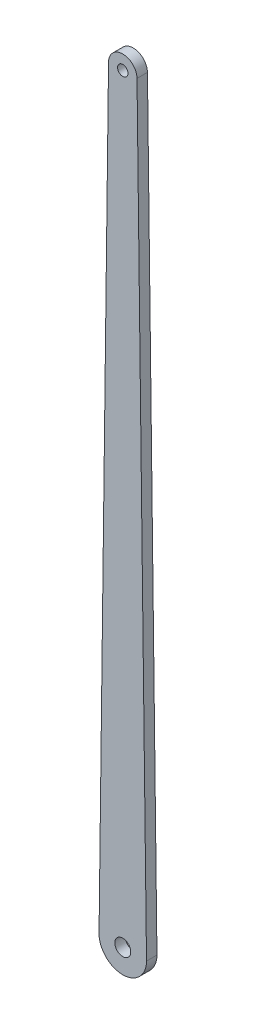
ISO-10303-21;
HEADER;
FILE_DESCRIPTION(('STEP AP214'),'2;1');
FILE_NAME('part.step','',(''),(''),'','','');
FILE_SCHEMA(('AUTOMOTIVE_DESIGN { 1 0 10303 214 1 1 1 1 }'));
ENDSEC;
DATA;
#1=APPLICATION_CONTEXT('core data for automotive mechanical design processes');
#2=APPLICATION_PROTOCOL_DEFINITION('international standard','automotive_design',2000,#1);
#3=PRODUCT_CONTEXT('',#1,'mechanical');
#4=PRODUCT('Part','Part','',(#3));
#5=PRODUCT_RELATED_PRODUCT_CATEGORY('part','',(#4));
#6=PRODUCT_DEFINITION_FORMATION('','',#4);
#7=PRODUCT_DEFINITION_CONTEXT('part definition',#1,'design');
#8=PRODUCT_DEFINITION('design','',#6,#7);
#9=PRODUCT_DEFINITION_SHAPE('','',#8);
#10=(LENGTH_UNIT() NAMED_UNIT(*) SI_UNIT(.MILLI.,.METRE.));
#11=(NAMED_UNIT(*) PLANE_ANGLE_UNIT() SI_UNIT($,.RADIAN.));
#12=(NAMED_UNIT(*) SI_UNIT($,.STERADIAN.) SOLID_ANGLE_UNIT());
#13=UNCERTAINTY_MEASURE_WITH_UNIT(LENGTH_MEASURE(1.E-05),#10,'distance_accuracy_value','');
#14=(GEOMETRIC_REPRESENTATION_CONTEXT(3) GLOBAL_UNCERTAINTY_ASSIGNED_CONTEXT((#13)) GLOBAL_UNIT_ASSIGNED_CONTEXT((#10,
#11,#12)) REPRESENTATION_CONTEXT('',''));
#15=CARTESIAN_POINT('',(0.,0.,0.));
#16=DIRECTION('',(0.,0.,1.));
#17=DIRECTION('',(1.,0.,0.));
#18=AXIS2_PLACEMENT_3D('',#15,#16,#17);
#19=CARTESIAN_POINT('',(0.,0.,5.5));
#20=DIRECTION('',(0.,0.,-1.));
#21=DIRECTION('',(-1.,0.,0.));
#22=AXIS2_PLACEMENT_3D('',#19,#20,#21);
#23=CYLINDRICAL_SURFACE('',#22,12.5);
#24=CARTESIAN_POINT('',(0.,0.,0.));
#25=DIRECTION('',(0.,0.,1.));
#26=DIRECTION('',(1.,0.,0.));
#27=AXIS2_PLACEMENT_3D('',#24,#25,#26);
#28=CIRCLE('',#27,12.5);
#29=CARTESIAN_POINT('',(-12.5,0.,0.));
#30=VERTEX_POINT('',#29);
#31=CARTESIAN_POINT('',(12.5,0.,0.));
#32=VERTEX_POINT('',#31);
#33=EDGE_CURVE('E108',#30,#32,#28,.T.);
#34=ORIENTED_EDGE('',*,*,#33,.T.);
#35=DIRECTION('',(0.,0.,-1.));
#36=VECTOR('',#35,1.);
#37=CARTESIAN_POINT('',(12.5,0.,5.5));
#38=LINE('',#37,#36);
#39=CARTESIAN_POINT('',(12.5,0.,5.5));
#40=VERTEX_POINT('',#39);
#41=EDGE_CURVE('E11',#40,#32,#38,.T.);
#42=ORIENTED_EDGE('',*,*,#41,.F.);
#43=CARTESIAN_POINT('',(0.,0.,5.5));
#44=DIRECTION('',(0.,0.,1.));
#45=DIRECTION('',(1.,0.,0.));
#46=AXIS2_PLACEMENT_3D('',#43,#44,#45);
#47=CIRCLE('',#46,12.5);
#48=CARTESIAN_POINT('',(-12.5,0.,5.5));
#49=VERTEX_POINT('',#48);
#50=EDGE_CURVE('E87',#49,#40,#47,.T.);
#51=ORIENTED_EDGE('',*,*,#50,.F.);
#52=DIRECTION('',(0.,0.,-1.));
#53=VECTOR('',#52,1.);
#54=CARTESIAN_POINT('',(-12.5,0.,5.5));
#55=LINE('',#54,#53);
#56=EDGE_CURVE('E107',#49,#30,#55,.T.);
#57=ORIENTED_EDGE('',*,*,#56,.T.);
#58=EDGE_LOOP('',(#34,#42,#51,#57));
#59=FACE_BOUND('',#58,.T.);
#60=ADVANCED_FACE('F39',(#59),#23,.T.);
#61=CARTESIAN_POINT('',(12.4980476375969,0.15620729278719,5.5));
#62=DIRECTION('',(-0.999921902454262,-0.0124975594516961,0.));
#63=DIRECTION('',(0.0124975594516961,-0.999921902454262,0.));
#64=AXIS2_PLACEMENT_3D('',#61,#62,#63);
#65=PLANE('',#64);
#66=DIRECTION('',(-0.0124975594516961,0.999921902454262,0.));
#67=VECTOR('',#66,1.);
#68=CARTESIAN_POINT('',(12.4980476375969,0.15620729278719,0.));
#69=LINE('',#68,#67);
#70=CARTESIAN_POINT('',(7.49941426840682,400.093731695888,0.));
#71=VERTEX_POINT('',#70);
#72=EDGE_CURVE('E92',#32,#71,#69,.T.);
#73=ORIENTED_EDGE('',*,*,#72,.T.);
#74=DIRECTION('',(0.,0.,-1.));
#75=VECTOR('',#74,1.);
#76=CARTESIAN_POINT('',(7.49941426840682,400.093731695888,5.5));
#77=LINE('',#76,#75);
#78=CARTESIAN_POINT('',(7.49941426840682,400.093731695888,5.5));
#79=VERTEX_POINT('',#78);
#80=EDGE_CURVE('E47',#79,#71,#77,.T.);
#81=ORIENTED_EDGE('',*,*,#80,.F.);
#82=DIRECTION('',(-0.0124975594516961,0.999921902454262,0.));
#83=VECTOR('',#82,1.);
#84=CARTESIAN_POINT('',(12.4980476375969,0.15620729278719,5.5));
#85=LINE('',#84,#83);
#86=EDGE_CURVE('E81',#40,#79,#85,.T.);
#87=ORIENTED_EDGE('',*,*,#86,.F.);
#88=ORIENTED_EDGE('',*,*,#41,.T.);
#89=EDGE_LOOP('',(#73,#81,#87,#88));
#90=FACE_BOUND('',#89,.T.);
#91=ADVANCED_FACE('F91',(#90),#65,.F.);
#92=CARTESIAN_POINT('',(0.,400.,5.5));
#93=DIRECTION('',(0.,0.,-1.));
#94=DIRECTION('',(-1.,0.,0.));
#95=AXIS2_PLACEMENT_3D('',#92,#93,#94);
#96=CYLINDRICAL_SURFACE('',#95,7.49999999999993);
#97=CARTESIAN_POINT('',(0.,400.,0.));
#98=DIRECTION('',(0.,0.,1.));
#99=DIRECTION('',(1.,0.,0.));
#100=AXIS2_PLACEMENT_3D('',#97,#98,#99);
#101=CIRCLE('',#100,7.49999999999993);
#102=CARTESIAN_POINT('',(-7.49941426840697,400.093731695888,0.));
#103=VERTEX_POINT('',#102);
#104=EDGE_CURVE('E112',#103,#71,#101,.F.);
#105=ORIENTED_EDGE('',*,*,#104,.F.);
#106=DIRECTION('',(0.,0.,-1.));
#107=VECTOR('',#106,1.);
#108=CARTESIAN_POINT('',(-7.49941426840697,400.093731695888,5.5));
#109=LINE('',#108,#107);
#110=CARTESIAN_POINT('',(-7.49941426840697,400.093731695888,5.5));
#111=VERTEX_POINT('',#110);
#112=EDGE_CURVE('E71',#111,#103,#109,.T.);
#113=ORIENTED_EDGE('',*,*,#112,.F.);
#114=CARTESIAN_POINT('',(0.,400.,5.5));
#115=DIRECTION('',(0.,0.,1.));
#116=DIRECTION('',(1.,0.,0.));
#117=AXIS2_PLACEMENT_3D('',#114,#115,#116);
#118=CIRCLE('',#117,7.49999999999993);
#119=EDGE_CURVE('E85',#111,#79,#118,.F.);
#120=ORIENTED_EDGE('',*,*,#119,.T.);
#121=ORIENTED_EDGE('',*,*,#80,.T.);
#122=EDGE_LOOP('',(#105,#113,#120,#121));
#123=FACE_BOUND('',#122,.T.);
#124=ADVANCED_FACE('F96',(#123),#96,.T.);
#125=CARTESIAN_POINT('',(0.,400.,5.5));
#126=DIRECTION('',(0.,0.,-1.));
#127=DIRECTION('',(-1.,0.,0.));
#128=AXIS2_PLACEMENT_3D('',#125,#126,#127);
#129=CYLINDRICAL_SURFACE('',#128,2.75);
#130=CARTESIAN_POINT('',(0.,400.,5.5));
#131=DIRECTION('',(0.,0.,1.));
#132=DIRECTION('',(1.,0.,0.));
#133=AXIS2_PLACEMENT_3D('',#130,#131,#132);
#134=CIRCLE('',#133,2.75);
#135=CARTESIAN_POINT('',(2.75,400.,5.5));
#136=VERTEX_POINT('',#135);
#137=EDGE_CURVE('E98',#136,#136,#134,.T.);
#138=ORIENTED_EDGE('',*,*,#137,.T.);
#139=EDGE_LOOP('',(#138));
#140=FACE_BOUND('',#139,.T.);
#141=CARTESIAN_POINT('',(0.,400.,0.));
#142=DIRECTION('',(0.,0.,1.));
#143=DIRECTION('',(1.,0.,0.));
#144=AXIS2_PLACEMENT_3D('',#141,#142,#143);
#145=CIRCLE('',#144,2.75);
#146=CARTESIAN_POINT('',(2.75,400.,0.));
#147=VERTEX_POINT('',#146);
#148=EDGE_CURVE('E115',#147,#147,#145,.T.);
#149=ORIENTED_EDGE('',*,*,#148,.F.);
#150=EDGE_LOOP('',(#149));
#151=FACE_BOUND('',#150,.T.);
#152=ADVANCED_FACE('F143',(#140,#151),#129,.F.);
#153=CARTESIAN_POINT('',(-12.4980476375969,0.156207292787185,5.5));
#154=DIRECTION('',(0.999921902454262,-0.0124975594516957,0.));
#155=DIRECTION('',(0.0124975594516957,0.999921902454262,0.));
#156=AXIS2_PLACEMENT_3D('',#153,#154,#155);
#157=PLANE('',#156);
#158=DIRECTION('',(-0.0124975594516957,-0.999921902454262,0.));
#159=VECTOR('',#158,1.);
#160=CARTESIAN_POINT('',(-12.4980476375969,0.156207292787185,0.));
#161=LINE('',#160,#159);
#162=EDGE_CURVE('E74',#103,#30,#161,.T.);
#163=ORIENTED_EDGE('',*,*,#162,.T.);
#164=ORIENTED_EDGE('',*,*,#56,.F.);
#165=DIRECTION('',(-0.0124975594516957,-0.999921902454262,0.));
#166=VECTOR('',#165,1.);
#167=CARTESIAN_POINT('',(-12.4980476375969,0.156207292787185,5.5));
#168=LINE('',#167,#166);
#169=EDGE_CURVE('E55',#111,#49,#168,.T.);
#170=ORIENTED_EDGE('',*,*,#169,.F.);
#171=ORIENTED_EDGE('',*,*,#112,.T.);
#172=EDGE_LOOP('',(#163,#164,#170,#171));
#173=FACE_BOUND('',#172,.T.);
#174=ADVANCED_FACE('F135',(#173),#157,.F.);
#175=CARTESIAN_POINT('',(0.,0.,5.5));
#176=DIRECTION('',(0.,0.,-1.));
#177=DIRECTION('',(-1.,0.,0.));
#178=AXIS2_PLACEMENT_3D('',#175,#176,#177);
#179=CYLINDRICAL_SURFACE('',#178,4.2);
#180=CARTESIAN_POINT('',(0.,0.,5.5));
#181=DIRECTION('',(0.,0.,1.));
#182=DIRECTION('',(1.,0.,0.));
#183=AXIS2_PLACEMENT_3D('',#180,#181,#182);
#184=CIRCLE('',#183,4.2);
#185=CARTESIAN_POINT('',(4.2,0.,5.5));
#186=VERTEX_POINT('',#185);
#187=EDGE_CURVE('E104',#186,#186,#184,.T.);
#188=ORIENTED_EDGE('',*,*,#187,.T.);
#189=EDGE_LOOP('',(#188));
#190=FACE_BOUND('',#189,.T.);
#191=CARTESIAN_POINT('',(0.,0.,0.));
#192=DIRECTION('',(0.,0.,1.));
#193=DIRECTION('',(1.,0.,0.));
#194=AXIS2_PLACEMENT_3D('',#191,#192,#193);
#195=CIRCLE('',#194,4.2);
#196=CARTESIAN_POINT('',(4.2,0.,0.));
#197=VERTEX_POINT('',#196);
#198=EDGE_CURVE('E118',#197,#197,#195,.T.);
#199=ORIENTED_EDGE('',*,*,#198,.F.);
#200=EDGE_LOOP('',(#199));
#201=FACE_BOUND('',#200,.T.);
#202=ADVANCED_FACE('F133',(#190,#201),#179,.F.);
#203=CARTESIAN_POINT('',(0.,0.,5.5));
#204=DIRECTION('',(0.,0.,1.));
#205=DIRECTION('',(1.,0.,0.));
#206=AXIS2_PLACEMENT_3D('',#203,#204,#205);
#207=PLANE('',#206);
#208=ORIENTED_EDGE('',*,*,#50,.T.);
#209=ORIENTED_EDGE('',*,*,#86,.T.);
#210=ORIENTED_EDGE('',*,*,#119,.F.);
#211=ORIENTED_EDGE('',*,*,#169,.T.);
#212=EDGE_LOOP('',(#208,#209,#210,#211));
#213=FACE_BOUND('',#212,.T.);
#214=ORIENTED_EDGE('',*,*,#137,.F.);
#215=EDGE_LOOP('',(#214));
#216=FACE_BOUND('',#215,.T.);
#217=ORIENTED_EDGE('',*,*,#187,.F.);
#218=EDGE_LOOP('',(#217));
#219=FACE_BOUND('',#218,.T.);
#220=ADVANCED_FACE('F82',(#213,#216,#219),#207,.T.);
#221=CARTESIAN_POINT('',(0.,0.,0.));
#222=DIRECTION('',(0.,0.,1.));
#223=DIRECTION('',(1.,0.,0.));
#224=AXIS2_PLACEMENT_3D('',#221,#222,#223);
#225=PLANE('',#224);
#226=ORIENTED_EDGE('',*,*,#33,.F.);
#227=ORIENTED_EDGE('',*,*,#162,.F.);
#228=ORIENTED_EDGE('',*,*,#104,.T.);
#229=ORIENTED_EDGE('',*,*,#72,.F.);
#230=EDGE_LOOP('',(#226,#227,#228,#229));
#231=FACE_BOUND('',#230,.T.);
#232=ORIENTED_EDGE('',*,*,#148,.T.);
#233=EDGE_LOOP('',(#232));
#234=FACE_BOUND('',#233,.T.);
#235=ORIENTED_EDGE('',*,*,#198,.T.);
#236=EDGE_LOOP('',(#235));
#237=FACE_BOUND('',#236,.T.);
#238=ADVANCED_FACE('F125',(#231,#234,#237),#225,.F.);
#239=CLOSED_SHELL('',(#60,#91,#124,#152,#174,#202,#220,#238));
#240=MANIFOLD_SOLID_BREP('B2',#239);
#241=ADVANCED_BREP_SHAPE_REPRESENTATION('',(#18,#240),#14);
#242=SHAPE_DEFINITION_REPRESENTATION(#9,#241);
ENDSEC;
END-ISO-10303-21;
